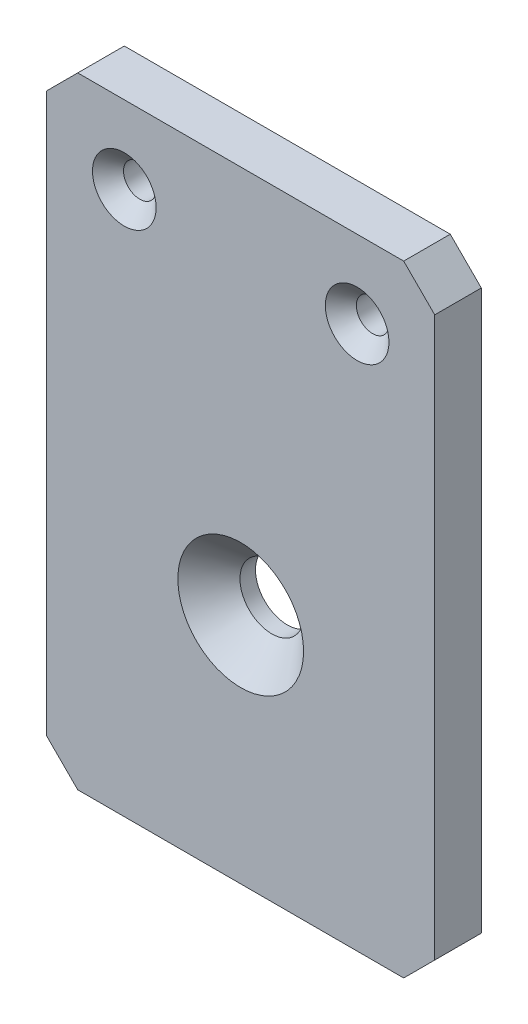
ISO-10303-21;
HEADER;
FILE_DESCRIPTION(('STEP AP214'),'2;1');
FILE_NAME('part.step','',(''),(''),'','','');
FILE_SCHEMA(('AUTOMOTIVE_DESIGN { 1 0 10303 214 1 1 1 1 }'));
ENDSEC;
DATA;
#1=APPLICATION_CONTEXT('core data for automotive mechanical design processes');
#2=APPLICATION_PROTOCOL_DEFINITION('international standard','automotive_design',2000,#1);
#3=PRODUCT_CONTEXT('',#1,'mechanical');
#4=PRODUCT('Part','Part','',(#3));
#5=PRODUCT_RELATED_PRODUCT_CATEGORY('part','',(#4));
#6=PRODUCT_DEFINITION_FORMATION('','',#4);
#7=PRODUCT_DEFINITION_CONTEXT('part definition',#1,'design');
#8=PRODUCT_DEFINITION('design','',#6,#7);
#9=PRODUCT_DEFINITION_SHAPE('','',#8);
#10=(LENGTH_UNIT() NAMED_UNIT(*) SI_UNIT(.MILLI.,.METRE.));
#11=(NAMED_UNIT(*) PLANE_ANGLE_UNIT() SI_UNIT($,.RADIAN.));
#12=(NAMED_UNIT(*) SI_UNIT($,.STERADIAN.) SOLID_ANGLE_UNIT());
#13=UNCERTAINTY_MEASURE_WITH_UNIT(LENGTH_MEASURE(1.E-05),#10,'distance_accuracy_value','');
#14=(GEOMETRIC_REPRESENTATION_CONTEXT(3) GLOBAL_UNCERTAINTY_ASSIGNED_CONTEXT((#13)) GLOBAL_UNIT_ASSIGNED_CONTEXT((#10,
#11,#12)) REPRESENTATION_CONTEXT('',''));
#15=CARTESIAN_POINT('',(0.,0.,0.));
#16=DIRECTION('',(0.,0.,1.));
#17=DIRECTION('',(1.,0.,0.));
#18=AXIS2_PLACEMENT_3D('',#15,#16,#17);
#19=CARTESIAN_POINT('',(0.,0.,3.));
#20=DIRECTION('',(0.,0.,1.));
#21=DIRECTION('',(1.,0.,0.));
#22=AXIS2_PLACEMENT_3D('',#19,#20,#21);
#23=PLANE('',#22);
#24=CARTESIAN_POINT('',(-15.,40.,3.));
#25=DIRECTION('',(0.,0.,1.));
#26=DIRECTION('',(1.,0.,0.));
#27=AXIS2_PLACEMENT_3D('',#24,#25,#26);
#28=CIRCLE('',#27,4.10000000000002);
#29=CARTESIAN_POINT('',(-10.9,40.,3.));
#30=VERTEX_POINT('',#29);
#31=EDGE_CURVE('E46',#30,#30,#28,.F.);
#32=ORIENTED_EDGE('',*,*,#31,.T.);
#33=EDGE_LOOP('',(#32));
#34=FACE_BOUND('',#33,.T.);
#35=CARTESIAN_POINT('',(15.,40.,3.));
#36=DIRECTION('',(0.,0.,1.));
#37=DIRECTION('',(1.,0.,0.));
#38=AXIS2_PLACEMENT_3D('',#35,#36,#37);
#39=CIRCLE('',#38,4.10000000000002);
#40=CARTESIAN_POINT('',(19.1,40.,3.));
#41=VERTEX_POINT('',#40);
#42=EDGE_CURVE('E174',#41,#41,#39,.F.);
#43=ORIENTED_EDGE('',*,*,#42,.T.);
#44=EDGE_LOOP('',(#43));
#45=FACE_BOUND('',#44,.T.);
#46=CARTESIAN_POINT('',(0.,0.,3.));
#47=DIRECTION('',(0.,0.,1.));
#48=DIRECTION('',(1.,0.,0.));
#49=AXIS2_PLACEMENT_3D('',#46,#47,#48);
#50=CIRCLE('',#49,8.10000000000002);
#51=CARTESIAN_POINT('',(8.10000000000002,0.,3.));
#52=VERTEX_POINT('',#51);
#53=EDGE_CURVE('E154',#52,#52,#50,.F.);
#54=ORIENTED_EDGE('',*,*,#53,.T.);
#55=EDGE_LOOP('',(#54));
#56=FACE_BOUND('',#55,.T.);
#57=DIRECTION('',(0.,1.,0.));
#58=VECTOR('',#57,1.);
#59=CARTESIAN_POINT('',(25.,-30.,3.));
#60=LINE('',#59,#58);
#61=CARTESIAN_POINT('',(25.,-26.,3.));
#62=VERTEX_POINT('',#61);
#63=CARTESIAN_POINT('',(25.,46.,3.));
#64=VERTEX_POINT('',#63);
#65=EDGE_CURVE('E207',#62,#64,#60,.T.);
#66=ORIENTED_EDGE('',*,*,#65,.T.);
#67=DIRECTION('',(0.707106781186546,-0.707106781186549,0.));
#68=VECTOR('',#67,1.);
#69=CARTESIAN_POINT('',(35.5,35.4999999999999,3.));
#70=LINE('',#69,#68);
#71=CARTESIAN_POINT('',(20.9999999999999,50.,3.));
#72=VERTEX_POINT('',#71);
#73=EDGE_CURVE('E157',#64,#72,#70,.F.);
#74=ORIENTED_EDGE('',*,*,#73,.T.);
#75=DIRECTION('',(-1.,0.,0.));
#76=VECTOR('',#75,1.);
#77=CARTESIAN_POINT('',(24.9999999999999,50.,3.));
#78=LINE('',#77,#76);
#79=CARTESIAN_POINT('',(-21.,50.,3.));
#80=VERTEX_POINT('',#79);
#81=EDGE_CURVE('E125',#72,#80,#78,.T.);
#82=ORIENTED_EDGE('',*,*,#81,.T.);
#83=DIRECTION('',(0.707106781186548,0.707106781186547,0.));
#84=VECTOR('',#83,1.);
#85=CARTESIAN_POINT('',(-35.5,35.5,3.));
#86=LINE('',#85,#84);
#87=CARTESIAN_POINT('',(-25.,46.,3.));
#88=VERTEX_POINT('',#87);
#89=EDGE_CURVE('E152',#80,#88,#86,.F.);
#90=ORIENTED_EDGE('',*,*,#89,.T.);
#91=DIRECTION('',(0.,-1.,0.));
#92=VECTOR('',#91,1.);
#93=CARTESIAN_POINT('',(-25.,-30.,3.));
#94=LINE('',#93,#92);
#95=CARTESIAN_POINT('',(-25.,-26.,3.));
#96=VERTEX_POINT('',#95);
#97=EDGE_CURVE('E132',#88,#96,#94,.T.);
#98=ORIENTED_EDGE('',*,*,#97,.T.);
#99=DIRECTION('',(-0.707106781186546,0.707106781186549,0.));
#100=VECTOR('',#99,1.);
#101=CARTESIAN_POINT('',(-25.5,-25.5,3.));
#102=LINE('',#101,#100);
#103=CARTESIAN_POINT('',(-21.,-30.,3.));
#104=VERTEX_POINT('',#103);
#105=EDGE_CURVE('E60',#96,#104,#102,.F.);
#106=ORIENTED_EDGE('',*,*,#105,.T.);
#107=DIRECTION('',(1.,0.,0.));
#108=VECTOR('',#107,1.);
#109=CARTESIAN_POINT('',(25.,-30.,3.));
#110=LINE('',#109,#108);
#111=CARTESIAN_POINT('',(21.,-30.,3.));
#112=VERTEX_POINT('',#111);
#113=EDGE_CURVE('E135',#104,#112,#110,.T.);
#114=ORIENTED_EDGE('',*,*,#113,.T.);
#115=DIRECTION('',(-0.707106781186549,-0.707106781186546,0.));
#116=VECTOR('',#115,1.);
#117=CARTESIAN_POINT('',(25.5,-25.5,3.));
#118=LINE('',#117,#116);
#119=EDGE_CURVE('E150',#112,#62,#118,.F.);
#120=ORIENTED_EDGE('',*,*,#119,.T.);
#121=EDGE_LOOP('',(#66,#74,#82,#90,#98,#106,#114,#120));
#122=FACE_BOUND('',#121,.T.);
#123=ADVANCED_FACE('F37',(#34,#45,#56,#122),#23,.T.);
#124=CARTESIAN_POINT('',(0.,0.,-3.));
#125=DIRECTION('',(0.,0.,1.));
#126=DIRECTION('',(1.,0.,0.));
#127=AXIS2_PLACEMENT_3D('',#124,#125,#126);
#128=PLANE('',#127);
#129=DIRECTION('',(-1.,0.,0.));
#130=VECTOR('',#129,1.);
#131=CARTESIAN_POINT('',(24.9999999999999,50.,-3.));
#132=LINE('',#131,#130);
#133=CARTESIAN_POINT('',(20.9999999999999,50.,-3.));
#134=VERTEX_POINT('',#133);
#135=CARTESIAN_POINT('',(-21.,50.,-3.));
#136=VERTEX_POINT('',#135);
#137=EDGE_CURVE('E122',#134,#136,#132,.T.);
#138=ORIENTED_EDGE('',*,*,#137,.F.);
#139=DIRECTION('',(-0.707106781186546,0.707106781186549,0.));
#140=VECTOR('',#139,1.);
#141=CARTESIAN_POINT('',(20.9999999999999,50.,-3.));
#142=LINE('',#141,#140);
#143=CARTESIAN_POINT('',(25.,46.,-3.));
#144=VERTEX_POINT('',#143);
#145=EDGE_CURVE('E105',#134,#144,#142,.F.);
#146=ORIENTED_EDGE('',*,*,#145,.T.);
#147=DIRECTION('',(0.,1.,0.));
#148=VECTOR('',#147,1.);
#149=CARTESIAN_POINT('',(25.,-30.,-3.));
#150=LINE('',#149,#148);
#151=CARTESIAN_POINT('',(25.,-26.,-3.));
#152=VERTEX_POINT('',#151);
#153=EDGE_CURVE('E133',#152,#144,#150,.T.);
#154=ORIENTED_EDGE('',*,*,#153,.F.);
#155=DIRECTION('',(0.707106781186549,0.707106781186546,0.));
#156=VECTOR('',#155,1.);
#157=CARTESIAN_POINT('',(25.,-26.,-3.));
#158=LINE('',#157,#156);
#159=CARTESIAN_POINT('',(21.,-30.,-3.));
#160=VERTEX_POINT('',#159);
#161=EDGE_CURVE('E143',#152,#160,#158,.F.);
#162=ORIENTED_EDGE('',*,*,#161,.T.);
#163=DIRECTION('',(1.,0.,0.));
#164=VECTOR('',#163,1.);
#165=CARTESIAN_POINT('',(25.,-30.,-3.));
#166=LINE('',#165,#164);
#167=CARTESIAN_POINT('',(-21.,-30.,-3.));
#168=VERTEX_POINT('',#167);
#169=EDGE_CURVE('E137',#168,#160,#166,.T.);
#170=ORIENTED_EDGE('',*,*,#169,.F.);
#171=DIRECTION('',(0.707106781186546,-0.707106781186549,0.));
#172=VECTOR('',#171,1.);
#173=CARTESIAN_POINT('',(-21.,-30.,-3.));
#174=LINE('',#173,#172);
#175=CARTESIAN_POINT('',(-25.,-26.,-3.));
#176=VERTEX_POINT('',#175);
#177=EDGE_CURVE('E126',#168,#176,#174,.F.);
#178=ORIENTED_EDGE('',*,*,#177,.T.);
#179=DIRECTION('',(0.,-1.,0.));
#180=VECTOR('',#179,1.);
#181=CARTESIAN_POINT('',(-25.,-30.,-3.));
#182=LINE('',#181,#180);
#183=CARTESIAN_POINT('',(-25.,46.,-3.));
#184=VERTEX_POINT('',#183);
#185=EDGE_CURVE('E201',#184,#176,#182,.T.);
#186=ORIENTED_EDGE('',*,*,#185,.F.);
#187=DIRECTION('',(-0.707106781186548,-0.707106781186547,0.));
#188=VECTOR('',#187,1.);
#189=CARTESIAN_POINT('',(-25.,46.,-3.));
#190=LINE('',#189,#188);
#191=EDGE_CURVE('E116',#184,#136,#190,.F.);
#192=ORIENTED_EDGE('',*,*,#191,.T.);
#193=EDGE_LOOP('',(#138,#146,#154,#162,#170,#178,#186,#192));
#194=FACE_BOUND('',#193,.T.);
#195=CARTESIAN_POINT('',(0.,0.,-3.));
#196=DIRECTION('',(0.,0.,1.));
#197=DIRECTION('',(1.,0.,0.));
#198=AXIS2_PLACEMENT_3D('',#195,#196,#197);
#199=CIRCLE('',#198,4.1);
#200=CARTESIAN_POINT('',(4.1,0.,-3.));
#201=VERTEX_POINT('',#200);
#202=EDGE_CURVE('E197',#201,#201,#199,.T.);
#203=ORIENTED_EDGE('',*,*,#202,.T.);
#204=EDGE_LOOP('',(#203));
#205=FACE_BOUND('',#204,.T.);
#206=CARTESIAN_POINT('',(-15.,40.,-3.));
#207=DIRECTION('',(0.,0.,1.));
#208=DIRECTION('',(1.,0.,0.));
#209=AXIS2_PLACEMENT_3D('',#206,#207,#208);
#210=CIRCLE('',#209,2.1);
#211=CARTESIAN_POINT('',(-12.9,40.,-3.));
#212=VERTEX_POINT('',#211);
#213=EDGE_CURVE('E195',#212,#212,#210,.T.);
#214=ORIENTED_EDGE('',*,*,#213,.T.);
#215=EDGE_LOOP('',(#214));
#216=FACE_BOUND('',#215,.T.);
#217=CARTESIAN_POINT('',(15.,40.,-3.));
#218=DIRECTION('',(0.,0.,1.));
#219=DIRECTION('',(1.,0.,0.));
#220=AXIS2_PLACEMENT_3D('',#217,#218,#219);
#221=CIRCLE('',#220,2.1);
#222=CARTESIAN_POINT('',(17.1,40.,-3.));
#223=VERTEX_POINT('',#222);
#224=EDGE_CURVE('E198',#223,#223,#221,.T.);
#225=ORIENTED_EDGE('',*,*,#224,.T.);
#226=EDGE_LOOP('',(#225));
#227=FACE_BOUND('',#226,.T.);
#228=ADVANCED_FACE('F129',(#194,#205,#216,#227),#128,.F.);
#229=CARTESIAN_POINT('',(-25.,-30.,3.));
#230=DIRECTION('',(1.,0.,0.));
#231=DIRECTION('',(0.,1.,0.));
#232=AXIS2_PLACEMENT_3D('',#229,#230,#231);
#233=PLANE('',#232);
#234=ORIENTED_EDGE('',*,*,#97,.F.);
#235=DIRECTION('',(0.,0.,-1.));
#236=VECTOR('',#235,1.);
#237=CARTESIAN_POINT('',(-25.,46.,3.));
#238=LINE('',#237,#236);
#239=EDGE_CURVE('E164',#88,#184,#238,.T.);
#240=ORIENTED_EDGE('',*,*,#239,.T.);
#241=ORIENTED_EDGE('',*,*,#185,.T.);
#242=DIRECTION('',(0.,0.,1.));
#243=VECTOR('',#242,1.);
#244=CARTESIAN_POINT('',(-25.,-26.,3.));
#245=LINE('',#244,#243);
#246=EDGE_CURVE('E162',#176,#96,#245,.T.);
#247=ORIENTED_EDGE('',*,*,#246,.T.);
#248=EDGE_LOOP('',(#234,#240,#241,#247));
#249=FACE_BOUND('',#248,.T.);
#250=ADVANCED_FACE('F229',(#249),#233,.F.);
#251=CARTESIAN_POINT('',(25.,-30.,3.));
#252=DIRECTION('',(0.,1.,0.));
#253=DIRECTION('',(-1.,0.,0.));
#254=AXIS2_PLACEMENT_3D('',#251,#252,#253);
#255=PLANE('',#254);
#256=ORIENTED_EDGE('',*,*,#169,.T.);
#257=DIRECTION('',(0.,0.,1.));
#258=VECTOR('',#257,1.);
#259=CARTESIAN_POINT('',(21.,-30.,3.));
#260=LINE('',#259,#258);
#261=EDGE_CURVE('E53',#160,#112,#260,.T.);
#262=ORIENTED_EDGE('',*,*,#261,.T.);
#263=ORIENTED_EDGE('',*,*,#113,.F.);
#264=DIRECTION('',(0.,0.,-1.));
#265=VECTOR('',#264,1.);
#266=CARTESIAN_POINT('',(-21.,-30.,3.));
#267=LINE('',#266,#265);
#268=EDGE_CURVE('E167',#104,#168,#267,.T.);
#269=ORIENTED_EDGE('',*,*,#268,.T.);
#270=EDGE_LOOP('',(#256,#262,#263,#269));
#271=FACE_BOUND('',#270,.T.);
#272=ADVANCED_FACE('F213',(#271),#255,.F.);
#273=CARTESIAN_POINT('',(25.,-30.,3.));
#274=DIRECTION('',(-1.,0.,0.));
#275=DIRECTION('',(0.,-1.,0.));
#276=AXIS2_PLACEMENT_3D('',#273,#274,#275);
#277=PLANE('',#276);
#278=ORIENTED_EDGE('',*,*,#153,.T.);
#279=DIRECTION('',(0.,0.,1.));
#280=VECTOR('',#279,1.);
#281=CARTESIAN_POINT('',(25.,46.,3.));
#282=LINE('',#281,#280);
#283=EDGE_CURVE('E110',#144,#64,#282,.T.);
#284=ORIENTED_EDGE('',*,*,#283,.T.);
#285=ORIENTED_EDGE('',*,*,#65,.F.);
#286=DIRECTION('',(0.,0.,-1.));
#287=VECTOR('',#286,1.);
#288=CARTESIAN_POINT('',(25.,-26.,3.));
#289=LINE('',#288,#287);
#290=EDGE_CURVE('E115',#62,#152,#289,.T.);
#291=ORIENTED_EDGE('',*,*,#290,.T.);
#292=EDGE_LOOP('',(#278,#284,#285,#291));
#293=FACE_BOUND('',#292,.T.);
#294=ADVANCED_FACE('F221',(#293),#277,.F.);
#295=CARTESIAN_POINT('',(24.9999999999999,50.,3.));
#296=DIRECTION('',(0.,-1.,0.));
#297=DIRECTION('',(1.,0.,0.));
#298=AXIS2_PLACEMENT_3D('',#295,#296,#297);
#299=PLANE('',#298);
#300=ORIENTED_EDGE('',*,*,#81,.F.);
#301=DIRECTION('',(0.,0.,-1.));
#302=VECTOR('',#301,1.);
#303=CARTESIAN_POINT('',(20.9999999999999,50.,3.));
#304=LINE('',#303,#302);
#305=EDGE_CURVE('E109',#72,#134,#304,.T.);
#306=ORIENTED_EDGE('',*,*,#305,.T.);
#307=ORIENTED_EDGE('',*,*,#137,.T.);
#308=DIRECTION('',(0.,0.,1.));
#309=VECTOR('',#308,1.);
#310=CARTESIAN_POINT('',(-21.,50.,3.));
#311=LINE('',#310,#309);
#312=EDGE_CURVE('E127',#136,#80,#311,.T.);
#313=ORIENTED_EDGE('',*,*,#312,.T.);
#314=EDGE_LOOP('',(#300,#306,#307,#313));
#315=FACE_BOUND('',#314,.T.);
#316=ADVANCED_FACE('F121',(#315),#299,.F.);
#317=CARTESIAN_POINT('',(0.,0.,3.));
#318=DIRECTION('',(0.,0.,-1.));
#319=DIRECTION('',(-1.,0.,0.));
#320=AXIS2_PLACEMENT_3D('',#317,#318,#319);
#321=CYLINDRICAL_SURFACE('',#320,4.1);
#322=CARTESIAN_POINT('',(0.,0.,-1.00000000000001));
#323=DIRECTION('',(0.,0.,1.));
#324=DIRECTION('',(1.,0.,0.));
#325=AXIS2_PLACEMENT_3D('',#322,#323,#324);
#326=CIRCLE('',#325,4.1);
#327=CARTESIAN_POINT('',(4.1,0.,-1.00000000000001));
#328=VERTEX_POINT('',#327);
#329=EDGE_CURVE('E159',#328,#328,#326,.T.);
#330=ORIENTED_EDGE('',*,*,#329,.T.);
#331=EDGE_LOOP('',(#330));
#332=FACE_BOUND('',#331,.T.);
#333=ORIENTED_EDGE('',*,*,#202,.F.);
#334=EDGE_LOOP('',(#333));
#335=FACE_BOUND('',#334,.T.);
#336=ADVANCED_FACE('F191',(#332,#335),#321,.F.);
#337=CARTESIAN_POINT('',(-15.,40.,3.));
#338=DIRECTION('',(0.,0.,-1.));
#339=DIRECTION('',(-1.,0.,0.));
#340=AXIS2_PLACEMENT_3D('',#337,#338,#339);
#341=CYLINDRICAL_SURFACE('',#340,2.1);
#342=CARTESIAN_POINT('',(-15.,40.,0.999999999999983));
#343=DIRECTION('',(0.,0.,1.));
#344=DIRECTION('',(1.,0.,0.));
#345=AXIS2_PLACEMENT_3D('',#342,#343,#344);
#346=CIRCLE('',#345,2.1);
#347=CARTESIAN_POINT('',(-12.9,40.,0.999999999999983));
#348=VERTEX_POINT('',#347);
#349=EDGE_CURVE('E171',#348,#348,#346,.T.);
#350=ORIENTED_EDGE('',*,*,#349,.T.);
#351=EDGE_LOOP('',(#350));
#352=FACE_BOUND('',#351,.T.);
#353=ORIENTED_EDGE('',*,*,#213,.F.);
#354=EDGE_LOOP('',(#353));
#355=FACE_BOUND('',#354,.T.);
#356=ADVANCED_FACE('F187',(#352,#355),#341,.F.);
#357=CARTESIAN_POINT('',(15.,40.,3.));
#358=DIRECTION('',(0.,0.,-1.));
#359=DIRECTION('',(-1.,0.,0.));
#360=AXIS2_PLACEMENT_3D('',#357,#358,#359);
#361=CYLINDRICAL_SURFACE('',#360,2.1);
#362=CARTESIAN_POINT('',(15.,40.,0.999999999999984));
#363=DIRECTION('',(0.,0.,1.));
#364=DIRECTION('',(1.,0.,0.));
#365=AXIS2_PLACEMENT_3D('',#362,#363,#364);
#366=CIRCLE('',#365,2.1);
#367=CARTESIAN_POINT('',(17.1,40.,0.999999999999984));
#368=VERTEX_POINT('',#367);
#369=EDGE_CURVE('E11',#368,#368,#366,.T.);
#370=ORIENTED_EDGE('',*,*,#369,.T.);
#371=EDGE_LOOP('',(#370));
#372=FACE_BOUND('',#371,.T.);
#373=ORIENTED_EDGE('',*,*,#224,.F.);
#374=EDGE_LOOP('',(#373));
#375=FACE_BOUND('',#374,.T.);
#376=ADVANCED_FACE('F190',(#372,#375),#361,.F.);
#377=CARTESIAN_POINT('',(20.9999999999999,50.,3.));
#378=DIRECTION('',(-0.707106781186549,-0.707106781186546,0.));
#379=DIRECTION('',(0.,0.,-1.));
#380=AXIS2_PLACEMENT_3D('',#377,#378,#379);
#381=PLANE('',#380);
#382=ORIENTED_EDGE('',*,*,#73,.F.);
#383=ORIENTED_EDGE('',*,*,#283,.F.);
#384=ORIENTED_EDGE('',*,*,#145,.F.);
#385=ORIENTED_EDGE('',*,*,#305,.F.);
#386=EDGE_LOOP('',(#382,#383,#384,#385));
#387=FACE_BOUND('',#386,.T.);
#388=ADVANCED_FACE('F108',(#387),#381,.F.);
#389=CARTESIAN_POINT('',(0.,0.,-1.00000000000001));
#390=DIRECTION('',(0.,0.,1.));
#391=DIRECTION('',(1.,0.,0.));
#392=AXIS2_PLACEMENT_3D('',#389,#390,#391);
#393=CONICAL_SURFACE('',#392,4.1,0.78539816339745);
#394=ORIENTED_EDGE('',*,*,#53,.F.);
#395=EDGE_LOOP('',(#394));
#396=FACE_BOUND('',#395,.T.);
#397=ORIENTED_EDGE('',*,*,#329,.F.);
#398=EDGE_LOOP('',(#397));
#399=FACE_BOUND('',#398,.T.);
#400=ADVANCED_FACE('F246',(#396,#399),#393,.F.);
#401=CARTESIAN_POINT('',(-25.,46.,3.));
#402=DIRECTION('',(0.707106781186547,-0.707106781186548,0.));
#403=DIRECTION('',(0.,0.,-1.));
#404=AXIS2_PLACEMENT_3D('',#401,#402,#403);
#405=PLANE('',#404);
#406=ORIENTED_EDGE('',*,*,#89,.F.);
#407=ORIENTED_EDGE('',*,*,#312,.F.);
#408=ORIENTED_EDGE('',*,*,#191,.F.);
#409=ORIENTED_EDGE('',*,*,#239,.F.);
#410=EDGE_LOOP('',(#406,#407,#408,#409));
#411=FACE_BOUND('',#410,.T.);
#412=ADVANCED_FACE('F263',(#411),#405,.F.);
#413=CARTESIAN_POINT('',(25.,-26.,3.));
#414=DIRECTION('',(-0.707106781186546,0.707106781186549,0.));
#415=DIRECTION('',(0.,0.,-1.));
#416=AXIS2_PLACEMENT_3D('',#413,#414,#415);
#417=PLANE('',#416);
#418=ORIENTED_EDGE('',*,*,#119,.F.);
#419=ORIENTED_EDGE('',*,*,#261,.F.);
#420=ORIENTED_EDGE('',*,*,#161,.F.);
#421=ORIENTED_EDGE('',*,*,#290,.F.);
#422=EDGE_LOOP('',(#418,#419,#420,#421));
#423=FACE_BOUND('',#422,.T.);
#424=ADVANCED_FACE('F217',(#423),#417,.F.);
#425=CARTESIAN_POINT('',(-21.,-30.,3.));
#426=DIRECTION('',(0.707106781186549,0.707106781186546,0.));
#427=DIRECTION('',(0.,0.,-1.));
#428=AXIS2_PLACEMENT_3D('',#425,#426,#427);
#429=PLANE('',#428);
#430=ORIENTED_EDGE('',*,*,#105,.F.);
#431=ORIENTED_EDGE('',*,*,#246,.F.);
#432=ORIENTED_EDGE('',*,*,#177,.F.);
#433=ORIENTED_EDGE('',*,*,#268,.F.);
#434=EDGE_LOOP('',(#430,#431,#432,#433));
#435=FACE_BOUND('',#434,.T.);
#436=ADVANCED_FACE('F184',(#435),#429,.F.);
#437=CARTESIAN_POINT('',(-15.,40.,0.999999999999983));
#438=DIRECTION('',(0.,0.,1.));
#439=DIRECTION('',(1.,0.,0.));
#440=AXIS2_PLACEMENT_3D('',#437,#438,#439);
#441=CONICAL_SURFACE('',#440,2.1,0.78539816339745);
#442=ORIENTED_EDGE('',*,*,#31,.F.);
#443=EDGE_LOOP('',(#442));
#444=FACE_BOUND('',#443,.T.);
#445=ORIENTED_EDGE('',*,*,#349,.F.);
#446=EDGE_LOOP('',(#445));
#447=FACE_BOUND('',#446,.T.);
#448=ADVANCED_FACE('F181',(#444,#447),#441,.F.);
#449=CARTESIAN_POINT('',(15.,40.,0.999999999999984));
#450=DIRECTION('',(0.,0.,1.));
#451=DIRECTION('',(1.,0.,0.));
#452=AXIS2_PLACEMENT_3D('',#449,#450,#451);
#453=CONICAL_SURFACE('',#452,2.1,0.78539816339745);
#454=ORIENTED_EDGE('',*,*,#42,.F.);
#455=EDGE_LOOP('',(#454));
#456=FACE_BOUND('',#455,.T.);
#457=ORIENTED_EDGE('',*,*,#369,.F.);
#458=EDGE_LOOP('',(#457));
#459=FACE_BOUND('',#458,.T.);
#460=ADVANCED_FACE('F40',(#456,#459),#453,.F.);
#461=CLOSED_SHELL('',(#123,#228,#250,#272,#294,#316,#336,#356,#376,#388,#400,#412,#424,#436,
#448,#460));
#462=MANIFOLD_SOLID_BREP('B2',#461);
#463=ADVANCED_BREP_SHAPE_REPRESENTATION('',(#18,#462),#14);
#464=SHAPE_DEFINITION_REPRESENTATION(#9,#463);
ENDSEC;
END-ISO-10303-21;
